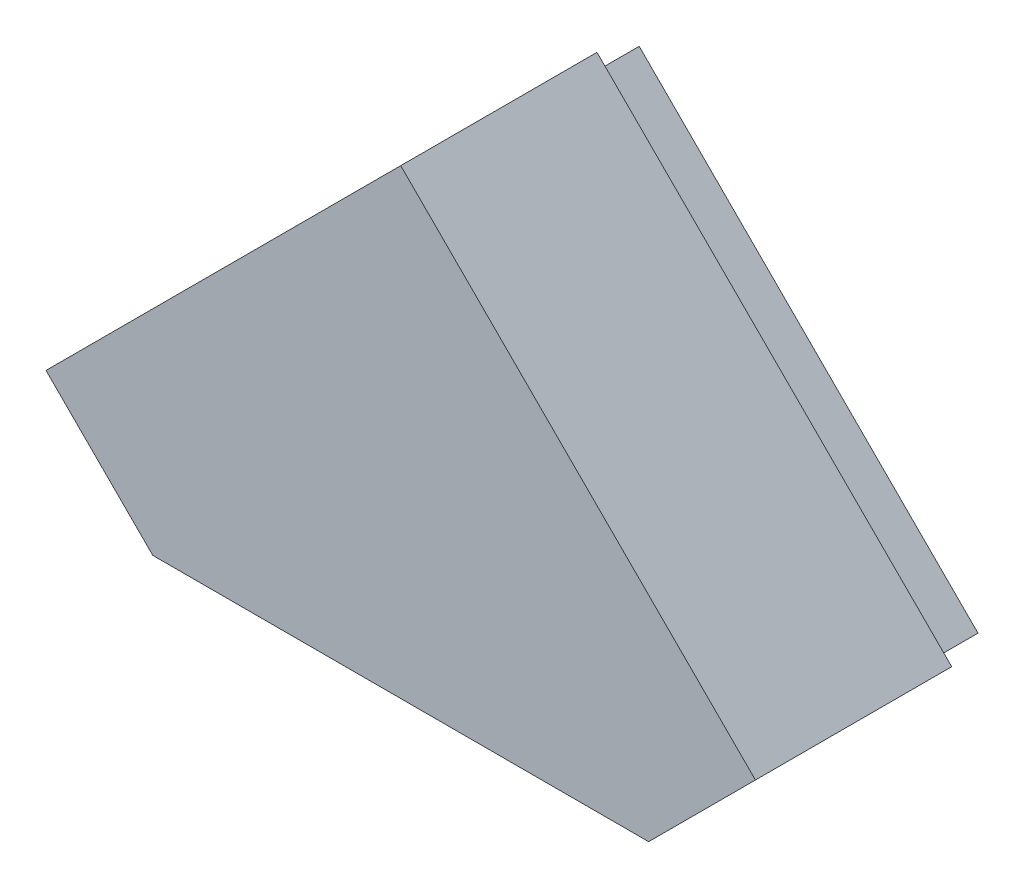
ISO-10303-21;
HEADER;
FILE_DESCRIPTION(('STEP AP214'),'2;1');
FILE_NAME('part.step','',(''),(''),'','','');
FILE_SCHEMA(('AUTOMOTIVE_DESIGN { 1 0 10303 214 1 1 1 1 }'));
ENDSEC;
DATA;
#1=APPLICATION_CONTEXT('core data for automotive mechanical design processes');
#2=APPLICATION_PROTOCOL_DEFINITION('international standard','automotive_design',2000,#1);
#3=PRODUCT_CONTEXT('',#1,'mechanical');
#4=PRODUCT('Part','Part','',(#3));
#5=PRODUCT_RELATED_PRODUCT_CATEGORY('part','',(#4));
#6=PRODUCT_DEFINITION_FORMATION('','',#4);
#7=PRODUCT_DEFINITION_CONTEXT('part definition',#1,'design');
#8=PRODUCT_DEFINITION('design','',#6,#7);
#9=PRODUCT_DEFINITION_SHAPE('','',#8);
#10=(LENGTH_UNIT() NAMED_UNIT(*) SI_UNIT(.MILLI.,.METRE.));
#11=(NAMED_UNIT(*) PLANE_ANGLE_UNIT() SI_UNIT($,.RADIAN.));
#12=(NAMED_UNIT(*) SI_UNIT($,.STERADIAN.) SOLID_ANGLE_UNIT());
#13=UNCERTAINTY_MEASURE_WITH_UNIT(LENGTH_MEASURE(1.E-05),#10,'distance_accuracy_value','');
#14=(GEOMETRIC_REPRESENTATION_CONTEXT(3) GLOBAL_UNCERTAINTY_ASSIGNED_CONTEXT((#13)) GLOBAL_UNIT_ASSIGNED_CONTEXT((#10,
#11,#12)) REPRESENTATION_CONTEXT('',''));
#15=CARTESIAN_POINT('',(0.,0.,0.));
#16=DIRECTION('',(0.,0.,1.));
#17=DIRECTION('',(1.,0.,0.));
#18=AXIS2_PLACEMENT_3D('',#15,#16,#17);
#19=CARTESIAN_POINT('',(-25.2114074291296,19.3014945146996,0.));
#20=DIRECTION('',(0.,0.,1.));
#21=DIRECTION('',(1.,0.,0.));
#22=AXIS2_PLACEMENT_3D('',#19,#20,#21);
#23=PLANE('',#22);
#24=DIRECTION('',(-1.,0.,0.));
#25=VECTOR('',#24,1.);
#26=CARTESIAN_POINT('',(17.2899494936612,-12.7,0.));
#27=LINE('',#26,#25);
#28=CARTESIAN_POINT('',(17.2899494936612,-12.7,0.));
#29=VERTEX_POINT('',#28);
#30=CARTESIAN_POINT('',(11.8,-12.7,0.));
#31=VERTEX_POINT('',#30);
#32=EDGE_CURVE('E112',#29,#31,#27,.T.);
#33=ORIENTED_EDGE('',*,*,#32,.F.);
#34=DIRECTION('',(-0.70710678118655,-0.707106781186545,0.));
#35=VECTOR('',#34,1.);
#36=CARTESIAN_POINT('',(24.0800365792311,-5.90991291443008,0.));
#37=LINE('',#36,#35);
#38=CARTESIAN_POINT('',(24.0800365792311,-5.90991291443008,0.));
#39=VERTEX_POINT('',#38);
#40=EDGE_CURVE('E116',#39,#29,#37,.T.);
#41=ORIENTED_EDGE('',*,*,#40,.F.);
#42=DIRECTION('',(0.707106781186547,-0.707106781186548,0.));
#43=VECTOR('',#42,1.);
#44=CARTESIAN_POINT('',(0.,18.1701236648011,0.));
#45=LINE('',#44,#43);
#46=CARTESIAN_POINT('',(0.,18.1701236648011,0.));
#47=VERTEX_POINT('',#46);
#48=EDGE_CURVE('E304',#47,#39,#45,.T.);
#49=ORIENTED_EDGE('',*,*,#48,.F.);
#50=DIRECTION('',(0.707106781186547,0.707106781186548,0.));
#51=VECTOR('',#50,1.);
#52=CARTESIAN_POINT('',(-24.0800365792311,-5.90991291443006,0.));
#53=LINE('',#52,#51);
#54=CARTESIAN_POINT('',(-24.0800365792311,-5.90991291443006,0.));
#55=VERTEX_POINT('',#54);
#56=EDGE_CURVE('E301',#55,#47,#53,.T.);
#57=ORIENTED_EDGE('',*,*,#56,.F.);
#58=DIRECTION('',(-0.707106781186548,0.707106781186547,0.));
#59=VECTOR('',#58,1.);
#60=CARTESIAN_POINT('',(-17.2899494936612,-12.7,0.));
#61=LINE('',#60,#59);
#62=CARTESIAN_POINT('',(-17.2899494936612,-12.7,0.));
#63=VERTEX_POINT('',#62);
#64=EDGE_CURVE('E298',#63,#55,#61,.T.);
#65=ORIENTED_EDGE('',*,*,#64,.F.);
#66=DIRECTION('',(-1.,0.,0.));
#67=VECTOR('',#66,1.);
#68=CARTESIAN_POINT('',(-11.8,-12.7,0.));
#69=LINE('',#68,#67);
#70=CARTESIAN_POINT('',(-11.8,-12.7,0.));
#71=VERTEX_POINT('',#70);
#72=EDGE_CURVE('E295',#71,#63,#69,.T.);
#73=ORIENTED_EDGE('',*,*,#72,.F.);
#74=DIRECTION('',(0.,1.,0.));
#75=VECTOR('',#74,1.);
#76=CARTESIAN_POINT('',(-11.8,21.375440072005,0.));
#77=LINE('',#76,#75);
#78=CARTESIAN_POINT('',(-11.8,-13.5,0.));
#79=VERTEX_POINT('',#78);
#80=EDGE_CURVE('E329',#79,#71,#77,.T.);
#81=ORIENTED_EDGE('',*,*,#80,.F.);
#82=DIRECTION('',(1.,0.,0.));
#83=VECTOR('',#82,1.);
#84=CARTESIAN_POINT('',(-25.2114074291296,-13.5,0.));
#85=LINE('',#84,#83);
#86=CARTESIAN_POINT('',(-17.6213203435596,-13.5,0.));
#87=VERTEX_POINT('',#86);
#88=EDGE_CURVE('E328',#87,#79,#85,.T.);
#89=ORIENTED_EDGE('',*,*,#88,.F.);
#90=DIRECTION('',(-0.707106781186548,0.707106781186547,0.));
#91=VECTOR('',#90,1.);
#92=CARTESIAN_POINT('',(-24.1507472573498,-6.97057308620988,0.));
#93=LINE('',#92,#91);
#94=CARTESIAN_POINT('',(-25.2114074291296,-5.90991291443006,0.));
#95=VERTEX_POINT('',#94);
#96=EDGE_CURVE('E339',#87,#95,#93,.T.);
#97=ORIENTED_EDGE('',*,*,#96,.T.);
#98=DIRECTION('',(0.707106781186547,0.707106781186548,0.));
#99=VECTOR('',#98,1.);
#100=CARTESIAN_POINT('',(-1.06066017177982,18.2408343429197,0.));
#101=LINE('',#100,#99);
#102=CARTESIAN_POINT('',(0.,19.3014945146996,0.));
#103=VERTEX_POINT('',#102);
#104=EDGE_CURVE('E337',#95,#103,#101,.T.);
#105=ORIENTED_EDGE('',*,*,#104,.T.);
#106=DIRECTION('',(0.707106781186547,-0.707106781186548,0.));
#107=VECTOR('',#106,1.);
#108=CARTESIAN_POINT('',(24.1507472573498,-4.84925274265025,0.));
#109=LINE('',#108,#107);
#110=CARTESIAN_POINT('',(25.2114074291296,-5.90991291443007,0.));
#111=VERTEX_POINT('',#110);
#112=EDGE_CURVE('E335',#103,#111,#109,.T.);
#113=ORIENTED_EDGE('',*,*,#112,.T.);
#114=DIRECTION('',(-0.707106781186549,-0.707106781186546,0.));
#115=VECTOR('',#114,1.);
#116=CARTESIAN_POINT('',(18.0606601717798,-13.0606601717798,0.));
#117=LINE('',#116,#115);
#118=CARTESIAN_POINT('',(17.6213203435596,-13.5,0.));
#119=VERTEX_POINT('',#118);
#120=EDGE_CURVE('E333',#111,#119,#117,.T.);
#121=ORIENTED_EDGE('',*,*,#120,.T.);
#122=CARTESIAN_POINT('',(11.8,-13.5,0.));
#123=VERTEX_POINT('',#122);
#124=EDGE_CURVE('E325',#123,#119,#85,.T.);
#125=ORIENTED_EDGE('',*,*,#124,.F.);
#126=DIRECTION('',(0.,-1.,0.));
#127=VECTOR('',#126,1.);
#128=CARTESIAN_POINT('',(11.8,21.375440072005,0.));
#129=LINE('',#128,#127);
#130=EDGE_CURVE('E331',#31,#123,#129,.T.);
#131=ORIENTED_EDGE('',*,*,#130,.F.);
#132=EDGE_LOOP('',(#33,#41,#49,#57,#65,#73,#81,#89,#97,#105,#113,#121,#125,#131));
#133=FACE_BOUND('',#132,.T.);
#134=ADVANCED_FACE('F95',(#133),#23,.F.);
#135=CARTESIAN_POINT('',(-24.1507472573498,-6.97057308620988,-12.75));
#136=DIRECTION('',(-0.707106781186547,-0.707106781186548,0.));
#137=DIRECTION('',(0.707106781186548,-0.707106781186547,0.));
#138=AXIS2_PLACEMENT_3D('',#135,#136,#137);
#139=PLANE('',#138);
#140=ORIENTED_EDGE('',*,*,#96,.F.);
#141=DIRECTION('',(0.,0.,1.));
#142=VECTOR('',#141,1.);
#143=CARTESIAN_POINT('',(-17.6213203435596,-13.5,-12.75));
#144=LINE('',#143,#142);
#145=CARTESIAN_POINT('',(-17.6213203435596,-13.5,13.95));
#146=VERTEX_POINT('',#145);
#147=EDGE_CURVE('E99',#87,#146,#144,.T.);
#148=ORIENTED_EDGE('',*,*,#147,.T.);
#149=DIRECTION('',(0.707106781186548,-0.707106781186547,0.));
#150=VECTOR('',#149,1.);
#151=CARTESIAN_POINT('',(-25.2114074291296,-5.90991291443006,13.95));
#152=LINE('',#151,#150);
#153=CARTESIAN_POINT('',(-25.2114074291296,-5.90991291443006,13.95));
#154=VERTEX_POINT('',#153);
#155=EDGE_CURVE('E363',#154,#146,#152,.T.);
#156=ORIENTED_EDGE('',*,*,#155,.F.);
#157=DIRECTION('',(0.,0.,1.));
#158=VECTOR('',#157,1.);
#159=CARTESIAN_POINT('',(-25.2114074291296,-5.90991291443006,-12.75));
#160=LINE('',#159,#158);
#161=EDGE_CURVE('E12',#95,#154,#160,.T.);
#162=ORIENTED_EDGE('',*,*,#161,.F.);
#163=EDGE_LOOP('',(#140,#148,#156,#162));
#164=FACE_BOUND('',#163,.T.);
#165=ADVANCED_FACE('F97',(#164),#139,.T.);
#166=CARTESIAN_POINT('',(-1.06066017177982,18.2408343429197,-12.75));
#167=DIRECTION('',(-0.707106781186548,0.707106781186547,0.));
#168=DIRECTION('',(-0.707106781186547,-0.707106781186548,0.));
#169=AXIS2_PLACEMENT_3D('',#166,#167,#168);
#170=PLANE('',#169);
#171=ORIENTED_EDGE('',*,*,#104,.F.);
#172=ORIENTED_EDGE('',*,*,#161,.T.);
#173=DIRECTION('',(-0.707106781186547,-0.707106781186548,0.));
#174=VECTOR('',#173,1.);
#175=CARTESIAN_POINT('',(0.,19.3014945146996,13.95));
#176=LINE('',#175,#174);
#177=CARTESIAN_POINT('',(0.,19.3014945146996,13.95));
#178=VERTEX_POINT('',#177);
#179=EDGE_CURVE('E360',#178,#154,#176,.T.);
#180=ORIENTED_EDGE('',*,*,#179,.F.);
#181=DIRECTION('',(0.,0.,1.));
#182=VECTOR('',#181,1.);
#183=CARTESIAN_POINT('',(0.,19.3014945146996,-12.75));
#184=LINE('',#183,#182);
#185=EDGE_CURVE('E104',#103,#178,#184,.T.);
#186=ORIENTED_EDGE('',*,*,#185,.F.);
#187=EDGE_LOOP('',(#171,#172,#180,#186));
#188=FACE_BOUND('',#187,.T.);
#189=ADVANCED_FACE('F431',(#188),#170,.T.);
#190=CARTESIAN_POINT('',(24.1507472573498,-4.84925274265025,-12.75));
#191=DIRECTION('',(0.707106781186548,0.707106781186547,0.));
#192=DIRECTION('',(-0.707106781186547,0.707106781186548,0.));
#193=AXIS2_PLACEMENT_3D('',#190,#191,#192);
#194=PLANE('',#193);
#195=ORIENTED_EDGE('',*,*,#112,.F.);
#196=ORIENTED_EDGE('',*,*,#185,.T.);
#197=DIRECTION('',(-0.707106781186547,0.707106781186548,0.));
#198=VECTOR('',#197,1.);
#199=CARTESIAN_POINT('',(25.2114074291296,-5.90991291443007,13.95));
#200=LINE('',#199,#198);
#201=CARTESIAN_POINT('',(25.2114074291296,-5.90991291443007,13.95));
#202=VERTEX_POINT('',#201);
#203=EDGE_CURVE('E357',#202,#178,#200,.T.);
#204=ORIENTED_EDGE('',*,*,#203,.F.);
#205=DIRECTION('',(0.,0.,1.));
#206=VECTOR('',#205,1.);
#207=CARTESIAN_POINT('',(25.2114074291296,-5.90991291443007,-12.75));
#208=LINE('',#207,#206);
#209=EDGE_CURVE('E395',#111,#202,#208,.T.);
#210=ORIENTED_EDGE('',*,*,#209,.F.);
#211=EDGE_LOOP('',(#195,#196,#204,#210));
#212=FACE_BOUND('',#211,.T.);
#213=ADVANCED_FACE('F422',(#212),#194,.T.);
#214=CARTESIAN_POINT('',(18.0606601717798,-13.0606601717798,-12.75));
#215=DIRECTION('',(0.707106781186546,-0.707106781186549,0.));
#216=DIRECTION('',(0.707106781186549,0.707106781186546,0.));
#217=AXIS2_PLACEMENT_3D('',#214,#215,#216);
#218=PLANE('',#217);
#219=ORIENTED_EDGE('',*,*,#120,.F.);
#220=ORIENTED_EDGE('',*,*,#209,.T.);
#221=DIRECTION('',(0.707106781186549,0.707106781186546,0.));
#222=VECTOR('',#221,1.);
#223=CARTESIAN_POINT('',(17.6213203435596,-13.5,13.95));
#224=LINE('',#223,#222);
#225=CARTESIAN_POINT('',(17.6213203435596,-13.5,13.95));
#226=VERTEX_POINT('',#225);
#227=EDGE_CURVE('E354',#226,#202,#224,.T.);
#228=ORIENTED_EDGE('',*,*,#227,.F.);
#229=DIRECTION('',(0.,0.,1.));
#230=VECTOR('',#229,1.);
#231=CARTESIAN_POINT('',(17.6213203435596,-13.5,-12.75));
#232=LINE('',#231,#230);
#233=EDGE_CURVE('E396',#119,#226,#232,.T.);
#234=ORIENTED_EDGE('',*,*,#233,.F.);
#235=EDGE_LOOP('',(#219,#220,#228,#234));
#236=FACE_BOUND('',#235,.T.);
#237=ADVANCED_FACE('F414',(#236),#218,.T.);
#238=CARTESIAN_POINT('',(-17.,-13.5,-12.75));
#239=DIRECTION('',(0.,-1.,0.));
#240=DIRECTION('',(0.,0.,-1.));
#241=AXIS2_PLACEMENT_3D('',#238,#239,#240);
#242=PLANE('',#241);
#243=ORIENTED_EDGE('',*,*,#124,.T.);
#244=ORIENTED_EDGE('',*,*,#233,.T.);
#245=DIRECTION('',(1.,0.,0.));
#246=VECTOR('',#245,1.);
#247=CARTESIAN_POINT('',(-17.6213203435596,-13.5,13.95));
#248=LINE('',#247,#246);
#249=EDGE_CURVE('E366',#146,#226,#248,.T.);
#250=ORIENTED_EDGE('',*,*,#249,.F.);
#251=ORIENTED_EDGE('',*,*,#147,.F.);
#252=ORIENTED_EDGE('',*,*,#88,.T.);
#253=DIRECTION('',(0.,0.,-1.));
#254=VECTOR('',#253,1.);
#255=CARTESIAN_POINT('',(-11.8,-13.5,11.8));
#256=LINE('',#255,#254);
#257=CARTESIAN_POINT('',(-11.8,-13.5,11.8));
#258=VERTEX_POINT('',#257);
#259=EDGE_CURVE('E347',#258,#79,#256,.T.);
#260=ORIENTED_EDGE('',*,*,#259,.F.);
#261=DIRECTION('',(-1.,0.,0.));
#262=VECTOR('',#261,1.);
#263=CARTESIAN_POINT('',(-11.8,-13.5,11.8));
#264=LINE('',#263,#262);
#265=CARTESIAN_POINT('',(11.8,-13.5,11.8));
#266=VERTEX_POINT('',#265);
#267=EDGE_CURVE('E344',#266,#258,#264,.T.);
#268=ORIENTED_EDGE('',*,*,#267,.F.);
#269=DIRECTION('',(0.,0.,1.));
#270=VECTOR('',#269,1.);
#271=CARTESIAN_POINT('',(11.8,-13.5,11.8));
#272=LINE('',#271,#270);
#273=EDGE_CURVE('E340',#123,#266,#272,.T.);
#274=ORIENTED_EDGE('',*,*,#273,.F.);
#275=EDGE_LOOP('',(#243,#244,#250,#251,#252,#260,#268,#274));
#276=FACE_BOUND('',#275,.T.);
#277=ADVANCED_FACE('F410',(#276),#242,.T.);
#278=CARTESIAN_POINT('',(0.,0.,13.95));
#279=DIRECTION('',(0.,0.,1.));
#280=DIRECTION('',(1.,0.,0.));
#281=AXIS2_PLACEMENT_3D('',#278,#279,#280);
#282=PLANE('',#281);
#283=ORIENTED_EDGE('',*,*,#227,.T.);
#284=ORIENTED_EDGE('',*,*,#203,.T.);
#285=ORIENTED_EDGE('',*,*,#179,.T.);
#286=ORIENTED_EDGE('',*,*,#155,.T.);
#287=ORIENTED_EDGE('',*,*,#249,.T.);
#288=EDGE_LOOP('',(#283,#284,#285,#286,#287));
#289=FACE_BOUND('',#288,.T.);
#290=ADVANCED_FACE('F407',(#289),#282,.T.);
#291=CARTESIAN_POINT('',(11.8,21.375440072005,11.8));
#292=DIRECTION('',(1.,0.,0.));
#293=DIRECTION('',(0.,0.,-1.));
#294=AXIS2_PLACEMENT_3D('',#291,#292,#293);
#295=PLANE('',#294);
#296=DIRECTION('',(0.,0.,-1.));
#297=VECTOR('',#296,1.);
#298=CARTESIAN_POINT('',(11.8,-12.,11.8));
#299=LINE('',#298,#297);
#300=CARTESIAN_POINT('',(11.8,-12.,11.8));
#301=VERTEX_POINT('',#300);
#302=CARTESIAN_POINT('',(11.8,-12.,-3.));
#303=VERTEX_POINT('',#302);
#304=EDGE_CURVE('E246',#301,#303,#299,.T.);
#305=ORIENTED_EDGE('',*,*,#304,.T.);
#306=DIRECTION('',(0.,1.,0.));
#307=VECTOR('',#306,1.);
#308=CARTESIAN_POINT('',(11.8,-12.7,-3.));
#309=LINE('',#308,#307);
#310=CARTESIAN_POINT('',(11.8,-12.7,-3.));
#311=VERTEX_POINT('',#310);
#312=EDGE_CURVE('E279',#311,#303,#309,.T.);
#313=ORIENTED_EDGE('',*,*,#312,.F.);
#314=DIRECTION('',(0.,0.,1.));
#315=VECTOR('',#314,1.);
#316=CARTESIAN_POINT('',(11.8,-12.7,-3.));
#317=LINE('',#316,#315);
#318=EDGE_CURVE('E294',#311,#31,#317,.T.);
#319=ORIENTED_EDGE('',*,*,#318,.T.);
#320=ORIENTED_EDGE('',*,*,#130,.T.);
#321=ORIENTED_EDGE('',*,*,#273,.T.);
#322=DIRECTION('',(0.,-1.,0.));
#323=VECTOR('',#322,1.);
#324=CARTESIAN_POINT('',(11.8,21.375440072005,11.8));
#325=LINE('',#324,#323);
#326=EDGE_CURVE('E349',#301,#266,#325,.T.);
#327=ORIENTED_EDGE('',*,*,#326,.F.);
#328=EDGE_LOOP('',(#305,#313,#319,#320,#321,#327));
#329=FACE_BOUND('',#328,.T.);
#330=ADVANCED_FACE('F420',(#329),#295,.F.);
#331=CARTESIAN_POINT('',(-11.8,21.375440072005,11.8));
#332=DIRECTION('',(-1.,0.,0.));
#333=DIRECTION('',(0.,0.,1.));
#334=AXIS2_PLACEMENT_3D('',#331,#332,#333);
#335=PLANE('',#334);
#336=ORIENTED_EDGE('',*,*,#259,.T.);
#337=ORIENTED_EDGE('',*,*,#80,.T.);
#338=DIRECTION('',(0.,0.,1.));
#339=VECTOR('',#338,1.);
#340=CARTESIAN_POINT('',(-11.8,-12.7,-3.));
#341=LINE('',#340,#339);
#342=CARTESIAN_POINT('',(-11.8,-12.7,-3.));
#343=VERTEX_POINT('',#342);
#344=EDGE_CURVE('E255',#343,#71,#341,.T.);
#345=ORIENTED_EDGE('',*,*,#344,.F.);
#346=DIRECTION('',(0.,-1.,0.));
#347=VECTOR('',#346,1.);
#348=CARTESIAN_POINT('',(-11.8,-12.,-3.));
#349=LINE('',#348,#347);
#350=CARTESIAN_POINT('',(-11.8,-12.,-3.));
#351=VERTEX_POINT('',#350);
#352=EDGE_CURVE('E250',#351,#343,#349,.T.);
#353=ORIENTED_EDGE('',*,*,#352,.F.);
#354=DIRECTION('',(0.,0.,1.));
#355=VECTOR('',#354,1.);
#356=CARTESIAN_POINT('',(-11.8,-12.,11.8));
#357=LINE('',#356,#355);
#358=CARTESIAN_POINT('',(-11.8,-12.,11.8));
#359=VERTEX_POINT('',#358);
#360=EDGE_CURVE('E237',#351,#359,#357,.T.);
#361=ORIENTED_EDGE('',*,*,#360,.T.);
#362=DIRECTION('',(0.,-1.,0.));
#363=VECTOR('',#362,1.);
#364=CARTESIAN_POINT('',(-11.8,21.375440072005,11.8));
#365=LINE('',#364,#363);
#366=EDGE_CURVE('E247',#359,#258,#365,.T.);
#367=ORIENTED_EDGE('',*,*,#366,.T.);
#368=EDGE_LOOP('',(#336,#337,#345,#353,#361,#367));
#369=FACE_BOUND('',#368,.T.);
#370=ADVANCED_FACE('F252',(#369),#335,.F.);
#371=CARTESIAN_POINT('',(-11.8,21.375440072005,11.8));
#372=DIRECTION('',(0.,0.,1.));
#373=DIRECTION('',(1.,0.,0.));
#374=AXIS2_PLACEMENT_3D('',#371,#372,#373);
#375=PLANE('',#374);
#376=DIRECTION('',(1.,0.,0.));
#377=VECTOR('',#376,1.);
#378=CARTESIAN_POINT('',(-11.8,-12.,11.8));
#379=LINE('',#378,#377);
#380=EDGE_CURVE('E243',#359,#301,#379,.T.);
#381=ORIENTED_EDGE('',*,*,#380,.T.);
#382=ORIENTED_EDGE('',*,*,#326,.T.);
#383=ORIENTED_EDGE('',*,*,#267,.T.);
#384=ORIENTED_EDGE('',*,*,#366,.F.);
#385=EDGE_LOOP('',(#381,#382,#383,#384));
#386=FACE_BOUND('',#385,.T.);
#387=ADVANCED_FACE('F438',(#386),#375,.F.);
#388=CARTESIAN_POINT('',(-17.,-12.,-12.75));
#389=DIRECTION('',(0.,-1.,0.));
#390=DIRECTION('',(0.,0.,-1.));
#391=AXIS2_PLACEMENT_3D('',#388,#389,#390);
#392=PLANE('',#391);
#393=DIRECTION('',(0.,0.,1.));
#394=VECTOR('',#393,1.);
#395=CARTESIAN_POINT('',(17.,-12.,-12.75));
#396=LINE('',#395,#394);
#397=CARTESIAN_POINT('',(17.,-12.,-3.));
#398=VERTEX_POINT('',#397);
#399=CARTESIAN_POINT('',(17.,-12.,12.75));
#400=VERTEX_POINT('',#399);
#401=EDGE_CURVE('E391',#398,#400,#396,.T.);
#402=ORIENTED_EDGE('',*,*,#401,.F.);
#403=DIRECTION('',(1.,0.,0.));
#404=VECTOR('',#403,1.);
#405=CARTESIAN_POINT('',(11.8,-12.,-3.));
#406=LINE('',#405,#404);
#407=EDGE_CURVE('E282',#303,#398,#406,.T.);
#408=ORIENTED_EDGE('',*,*,#407,.F.);
#409=ORIENTED_EDGE('',*,*,#304,.F.);
#410=ORIENTED_EDGE('',*,*,#380,.F.);
#411=ORIENTED_EDGE('',*,*,#360,.F.);
#412=DIRECTION('',(1.,0.,0.));
#413=VECTOR('',#412,1.);
#414=CARTESIAN_POINT('',(-17.,-12.,-3.));
#415=LINE('',#414,#413);
#416=CARTESIAN_POINT('',(-17.,-12.,-3.));
#417=VERTEX_POINT('',#416);
#418=EDGE_CURVE('E241',#417,#351,#415,.T.);
#419=ORIENTED_EDGE('',*,*,#418,.F.);
#420=DIRECTION('',(0.,0.,1.));
#421=VECTOR('',#420,1.);
#422=CARTESIAN_POINT('',(-17.,-12.,-12.75));
#423=LINE('',#422,#421);
#424=CARTESIAN_POINT('',(-17.,-12.,12.75));
#425=VERTEX_POINT('',#424);
#426=EDGE_CURVE('E384',#417,#425,#423,.T.);
#427=ORIENTED_EDGE('',*,*,#426,.T.);
#428=DIRECTION('',(1.,0.,0.));
#429=VECTOR('',#428,1.);
#430=CARTESIAN_POINT('',(-17.,-12.,12.75));
#431=LINE('',#430,#429);
#432=EDGE_CURVE('E372',#425,#400,#431,.T.);
#433=ORIENTED_EDGE('',*,*,#432,.T.);
#434=EDGE_LOOP('',(#402,#408,#409,#410,#411,#419,#427,#433));
#435=FACE_BOUND('',#434,.T.);
#436=ADVANCED_FACE('F239',(#435),#392,.F.);
#437=CARTESIAN_POINT('',(0.,0.,12.75));
#438=DIRECTION('',(0.,0.,1.));
#439=DIRECTION('',(1.,0.,0.));
#440=AXIS2_PLACEMENT_3D('',#437,#438,#439);
#441=PLANE('',#440);
#442=ORIENTED_EDGE('',*,*,#432,.F.);
#443=DIRECTION('',(0.707106781186548,-0.707106781186547,0.));
#444=VECTOR('',#443,1.);
#445=CARTESIAN_POINT('',(-23.09008708557,-5.90991291443006,12.75));
#446=LINE('',#445,#444);
#447=CARTESIAN_POINT('',(-23.09008708557,-5.90991291443006,12.75));
#448=VERTEX_POINT('',#447);
#449=EDGE_CURVE('E369',#448,#425,#446,.T.);
#450=ORIENTED_EDGE('',*,*,#449,.F.);
#451=DIRECTION('',(-0.707106781186547,-0.707106781186548,0.));
#452=VECTOR('',#451,1.);
#453=CARTESIAN_POINT('',(0.,17.1801741711399,12.75));
#454=LINE('',#453,#452);
#455=CARTESIAN_POINT('',(0.,17.1801741711399,12.75));
#456=VERTEX_POINT('',#455);
#457=EDGE_CURVE('E381',#456,#448,#454,.T.);
#458=ORIENTED_EDGE('',*,*,#457,.F.);
#459=DIRECTION('',(-0.707106781186547,0.707106781186548,0.));
#460=VECTOR('',#459,1.);
#461=CARTESIAN_POINT('',(23.09008708557,-5.90991291443007,12.75));
#462=LINE('',#461,#460);
#463=CARTESIAN_POINT('',(23.09008708557,-5.90991291443007,12.75));
#464=VERTEX_POINT('',#463);
#465=EDGE_CURVE('E378',#464,#456,#462,.T.);
#466=ORIENTED_EDGE('',*,*,#465,.F.);
#467=DIRECTION('',(0.707106781186549,0.707106781186546,0.));
#468=VECTOR('',#467,1.);
#469=CARTESIAN_POINT('',(17.,-12.,12.75));
#470=LINE('',#469,#468);
#471=EDGE_CURVE('E375',#400,#464,#470,.T.);
#472=ORIENTED_EDGE('',*,*,#471,.F.);
#473=EDGE_LOOP('',(#442,#450,#458,#466,#472));
#474=FACE_BOUND('',#473,.T.);
#475=ADVANCED_FACE('F444',(#474),#441,.F.);
#476=CARTESIAN_POINT('',(23.09008708557,-5.90991291443007,-12.75));
#477=DIRECTION('',(0.707106781186548,0.707106781186547,0.));
#478=DIRECTION('',(-0.707106781186547,0.707106781186548,0.));
#479=AXIS2_PLACEMENT_3D('',#476,#477,#478);
#480=PLANE('',#479);
#481=DIRECTION('',(0.,0.,1.));
#482=VECTOR('',#481,1.);
#483=CARTESIAN_POINT('',(0.,17.1801741711399,-12.75));
#484=LINE('',#483,#482);
#485=CARTESIAN_POINT('',(0.,17.1801741711399,-3.));
#486=VERTEX_POINT('',#485);
#487=EDGE_CURVE('E387',#486,#456,#484,.T.);
#488=ORIENTED_EDGE('',*,*,#487,.F.);
#489=DIRECTION('',(-0.707106781186547,0.707106781186548,0.));
#490=VECTOR('',#489,1.);
#491=CARTESIAN_POINT('',(23.09008708557,-5.90991291443007,-3.));
#492=LINE('',#491,#490);
#493=CARTESIAN_POINT('',(23.09008708557,-5.90991291443007,-3.));
#494=VERTEX_POINT('',#493);
#495=EDGE_CURVE('E288',#494,#486,#492,.T.);
#496=ORIENTED_EDGE('',*,*,#495,.F.);
#497=DIRECTION('',(0.,0.,1.));
#498=VECTOR('',#497,1.);
#499=CARTESIAN_POINT('',(23.09008708557,-5.90991291443007,-12.75));
#500=LINE('',#499,#498);
#501=EDGE_CURVE('E389',#494,#464,#500,.T.);
#502=ORIENTED_EDGE('',*,*,#501,.T.);
#503=ORIENTED_EDGE('',*,*,#465,.T.);
#504=EDGE_LOOP('',(#488,#496,#502,#503));
#505=FACE_BOUND('',#504,.T.);
#506=ADVANCED_FACE('F446',(#505),#480,.F.);
#507=CARTESIAN_POINT('',(17.,-12.,-12.75));
#508=DIRECTION('',(0.707106781186546,-0.707106781186549,0.));
#509=DIRECTION('',(0.707106781186549,0.707106781186546,0.));
#510=AXIS2_PLACEMENT_3D('',#507,#508,#509);
#511=PLANE('',#510);
#512=ORIENTED_EDGE('',*,*,#501,.F.);
#513=DIRECTION('',(0.707106781186549,0.707106781186546,0.));
#514=VECTOR('',#513,1.);
#515=CARTESIAN_POINT('',(17.,-12.,-3.));
#516=LINE('',#515,#514);
#517=EDGE_CURVE('E285',#398,#494,#516,.T.);
#518=ORIENTED_EDGE('',*,*,#517,.F.);
#519=ORIENTED_EDGE('',*,*,#401,.T.);
#520=ORIENTED_EDGE('',*,*,#471,.T.);
#521=EDGE_LOOP('',(#512,#518,#519,#520));
#522=FACE_BOUND('',#521,.T.);
#523=ADVANCED_FACE('F455',(#522),#511,.F.);
#524=CARTESIAN_POINT('',(-23.09008708557,-5.90991291443006,-12.75));
#525=DIRECTION('',(-0.707106781186547,-0.707106781186548,0.));
#526=DIRECTION('',(0.707106781186548,-0.707106781186547,0.));
#527=AXIS2_PLACEMENT_3D('',#524,#525,#526);
#528=PLANE('',#527);
#529=ORIENTED_EDGE('',*,*,#426,.F.);
#530=DIRECTION('',(0.707106781186548,-0.707106781186547,0.));
#531=VECTOR('',#530,1.);
#532=CARTESIAN_POINT('',(-23.09008708557,-5.90991291443006,-3.));
#533=LINE('',#532,#531);
#534=CARTESIAN_POINT('',(-23.09008708557,-5.90991291443006,-3.));
#535=VERTEX_POINT('',#534);
#536=EDGE_CURVE('E264',#535,#417,#533,.T.);
#537=ORIENTED_EDGE('',*,*,#536,.F.);
#538=DIRECTION('',(0.,0.,1.));
#539=VECTOR('',#538,1.);
#540=CARTESIAN_POINT('',(-23.09008708557,-5.90991291443006,-12.75));
#541=LINE('',#540,#539);
#542=EDGE_CURVE('E385',#535,#448,#541,.T.);
#543=ORIENTED_EDGE('',*,*,#542,.T.);
#544=ORIENTED_EDGE('',*,*,#449,.T.);
#545=EDGE_LOOP('',(#529,#537,#543,#544));
#546=FACE_BOUND('',#545,.T.);
#547=ADVANCED_FACE('F451',(#546),#528,.F.);
#548=CARTESIAN_POINT('',(0.,17.1801741711399,-12.75));
#549=DIRECTION('',(-0.707106781186548,0.707106781186547,0.));
#550=DIRECTION('',(-0.707106781186547,-0.707106781186548,0.));
#551=AXIS2_PLACEMENT_3D('',#548,#549,#550);
#552=PLANE('',#551);
#553=ORIENTED_EDGE('',*,*,#542,.F.);
#554=DIRECTION('',(-0.707106781186547,-0.707106781186548,0.));
#555=VECTOR('',#554,1.);
#556=CARTESIAN_POINT('',(0.,17.1801741711399,-3.));
#557=LINE('',#556,#555);
#558=EDGE_CURVE('E291',#486,#535,#557,.T.);
#559=ORIENTED_EDGE('',*,*,#558,.F.);
#560=ORIENTED_EDGE('',*,*,#487,.T.);
#561=ORIENTED_EDGE('',*,*,#457,.T.);
#562=EDGE_LOOP('',(#553,#559,#560,#561));
#563=FACE_BOUND('',#562,.T.);
#564=ADVANCED_FACE('F448',(#563),#552,.F.);
#565=CARTESIAN_POINT('',(-11.8,-12.7,-3.));
#566=DIRECTION('',(0.,1.,0.));
#567=DIRECTION('',(0.,0.,1.));
#568=AXIS2_PLACEMENT_3D('',#565,#566,#567);
#569=PLANE('',#568);
#570=ORIENTED_EDGE('',*,*,#72,.T.);
#571=DIRECTION('',(0.,0.,1.));
#572=VECTOR('',#571,1.);
#573=CARTESIAN_POINT('',(-17.2899494936612,-12.7,-3.));
#574=LINE('',#573,#572);
#575=CARTESIAN_POINT('',(-17.2899494936612,-12.7,-3.));
#576=VERTEX_POINT('',#575);
#577=EDGE_CURVE('E321',#576,#63,#574,.T.);
#578=ORIENTED_EDGE('',*,*,#577,.F.);
#579=DIRECTION('',(-1.,0.,0.));
#580=VECTOR('',#579,1.);
#581=CARTESIAN_POINT('',(-11.8,-12.7,-3.));
#582=LINE('',#581,#580);
#583=EDGE_CURVE('E258',#343,#576,#582,.T.);
#584=ORIENTED_EDGE('',*,*,#583,.F.);
#585=ORIENTED_EDGE('',*,*,#344,.T.);
#586=EDGE_LOOP('',(#570,#578,#584,#585));
#587=FACE_BOUND('',#586,.T.);
#588=ADVANCED_FACE('F434',(#587),#569,.F.);
#589=CARTESIAN_POINT('',(-17.2899494936612,-12.7,-3.));
#590=DIRECTION('',(0.707106781186547,0.707106781186548,0.));
#591=DIRECTION('',(-0.707106781186548,0.707106781186547,0.));
#592=AXIS2_PLACEMENT_3D('',#589,#590,#591);
#593=PLANE('',#592);
#594=ORIENTED_EDGE('',*,*,#64,.T.);
#595=DIRECTION('',(0.,0.,1.));
#596=VECTOR('',#595,1.);
#597=CARTESIAN_POINT('',(-24.0800365792311,-5.90991291443006,-3.));
#598=LINE('',#597,#596);
#599=CARTESIAN_POINT('',(-24.0800365792311,-5.90991291443006,-3.));
#600=VERTEX_POINT('',#599);
#601=EDGE_CURVE('E318',#600,#55,#598,.T.);
#602=ORIENTED_EDGE('',*,*,#601,.F.);
#603=DIRECTION('',(-0.707106781186548,0.707106781186547,0.));
#604=VECTOR('',#603,1.);
#605=CARTESIAN_POINT('',(-17.2899494936612,-12.7,-3.));
#606=LINE('',#605,#604);
#607=EDGE_CURVE('E269',#576,#600,#606,.T.);
#608=ORIENTED_EDGE('',*,*,#607,.F.);
#609=ORIENTED_EDGE('',*,*,#577,.T.);
#610=EDGE_LOOP('',(#594,#602,#608,#609));
#611=FACE_BOUND('',#610,.T.);
#612=ADVANCED_FACE('F501',(#611),#593,.F.);
#613=CARTESIAN_POINT('',(-24.0800365792311,-5.90991291443006,-3.));
#614=DIRECTION('',(0.707106781186548,-0.707106781186547,0.));
#615=DIRECTION('',(0.707106781186547,0.707106781186548,0.));
#616=AXIS2_PLACEMENT_3D('',#613,#614,#615);
#617=PLANE('',#616);
#618=ORIENTED_EDGE('',*,*,#56,.T.);
#619=DIRECTION('',(0.,0.,1.));
#620=VECTOR('',#619,1.);
#621=CARTESIAN_POINT('',(0.,18.1701236648011,-3.));
#622=LINE('',#621,#620);
#623=CARTESIAN_POINT('',(0.,18.1701236648011,-3.));
#624=VERTEX_POINT('',#623);
#625=EDGE_CURVE('E315',#624,#47,#622,.T.);
#626=ORIENTED_EDGE('',*,*,#625,.F.);
#627=DIRECTION('',(0.707106781186547,0.707106781186548,0.));
#628=VECTOR('',#627,1.);
#629=CARTESIAN_POINT('',(-24.0800365792311,-5.90991291443006,-3.));
#630=LINE('',#629,#628);
#631=EDGE_CURVE('E271',#600,#624,#630,.T.);
#632=ORIENTED_EDGE('',*,*,#631,.F.);
#633=ORIENTED_EDGE('',*,*,#601,.T.);
#634=EDGE_LOOP('',(#618,#626,#632,#633));
#635=FACE_BOUND('',#634,.T.);
#636=ADVANCED_FACE('F496',(#635),#617,.F.);
#637=CARTESIAN_POINT('',(0.,18.1701236648011,-3.));
#638=DIRECTION('',(-0.707106781186548,-0.707106781186547,0.));
#639=DIRECTION('',(0.707106781186547,-0.707106781186548,0.));
#640=AXIS2_PLACEMENT_3D('',#637,#638,#639);
#641=PLANE('',#640);
#642=ORIENTED_EDGE('',*,*,#48,.T.);
#643=DIRECTION('',(0.,0.,1.));
#644=VECTOR('',#643,1.);
#645=CARTESIAN_POINT('',(24.0800365792311,-5.90991291443008,-3.));
#646=LINE('',#645,#644);
#647=CARTESIAN_POINT('',(24.0800365792311,-5.90991291443008,-3.));
#648=VERTEX_POINT('',#647);
#649=EDGE_CURVE('E312',#648,#39,#646,.T.);
#650=ORIENTED_EDGE('',*,*,#649,.F.);
#651=DIRECTION('',(0.707106781186547,-0.707106781186548,0.));
#652=VECTOR('',#651,1.);
#653=CARTESIAN_POINT('',(0.,18.1701236648011,-3.));
#654=LINE('',#653,#652);
#655=EDGE_CURVE('E273',#624,#648,#654,.T.);
#656=ORIENTED_EDGE('',*,*,#655,.F.);
#657=ORIENTED_EDGE('',*,*,#625,.T.);
#658=EDGE_LOOP('',(#642,#650,#656,#657));
#659=FACE_BOUND('',#658,.T.);
#660=ADVANCED_FACE('F493',(#659),#641,.F.);
#661=CARTESIAN_POINT('',(24.0800365792311,-5.90991291443008,-3.));
#662=DIRECTION('',(-0.707106781186545,0.70710678118655,0.));
#663=DIRECTION('',(-0.70710678118655,-0.707106781186545,0.));
#664=AXIS2_PLACEMENT_3D('',#661,#662,#663);
#665=PLANE('',#664);
#666=ORIENTED_EDGE('',*,*,#40,.T.);
#667=DIRECTION('',(0.,0.,1.));
#668=VECTOR('',#667,1.);
#669=CARTESIAN_POINT('',(17.2899494936612,-12.7,-3.));
#670=LINE('',#669,#668);
#671=CARTESIAN_POINT('',(17.2899494936612,-12.7,-3.));
#672=VERTEX_POINT('',#671);
#673=EDGE_CURVE('E309',#672,#29,#670,.T.);
#674=ORIENTED_EDGE('',*,*,#673,.F.);
#675=DIRECTION('',(-0.70710678118655,-0.707106781186545,0.));
#676=VECTOR('',#675,1.);
#677=CARTESIAN_POINT('',(24.0800365792311,-5.90991291443008,-3.));
#678=LINE('',#677,#676);
#679=EDGE_CURVE('E275',#648,#672,#678,.T.);
#680=ORIENTED_EDGE('',*,*,#679,.F.);
#681=ORIENTED_EDGE('',*,*,#649,.T.);
#682=EDGE_LOOP('',(#666,#674,#680,#681));
#683=FACE_BOUND('',#682,.T.);
#684=ADVANCED_FACE('F489',(#683),#665,.F.);
#685=CARTESIAN_POINT('',(17.2899494936612,-12.7,-3.));
#686=DIRECTION('',(0.,1.,0.));
#687=DIRECTION('',(0.,0.,1.));
#688=AXIS2_PLACEMENT_3D('',#685,#686,#687);
#689=PLANE('',#688);
#690=ORIENTED_EDGE('',*,*,#32,.T.);
#691=ORIENTED_EDGE('',*,*,#318,.F.);
#692=DIRECTION('',(-1.,0.,0.));
#693=VECTOR('',#692,1.);
#694=CARTESIAN_POINT('',(17.2899494936612,-12.7,-3.));
#695=LINE('',#694,#693);
#696=EDGE_CURVE('E277',#672,#311,#695,.T.);
#697=ORIENTED_EDGE('',*,*,#696,.F.);
#698=ORIENTED_EDGE('',*,*,#673,.T.);
#699=EDGE_LOOP('',(#690,#691,#697,#698));
#700=FACE_BOUND('',#699,.T.);
#701=ADVANCED_FACE('F484',(#700),#689,.F.);
#702=CARTESIAN_POINT('',(0.,0.,-3.));
#703=DIRECTION('',(0.,0.,-1.));
#704=DIRECTION('',(-1.,0.,0.));
#705=AXIS2_PLACEMENT_3D('',#702,#703,#704);
#706=PLANE('',#705);
#707=ORIENTED_EDGE('',*,*,#418,.T.);
#708=ORIENTED_EDGE('',*,*,#352,.T.);
#709=ORIENTED_EDGE('',*,*,#583,.T.);
#710=ORIENTED_EDGE('',*,*,#607,.T.);
#711=ORIENTED_EDGE('',*,*,#631,.T.);
#712=ORIENTED_EDGE('',*,*,#655,.T.);
#713=ORIENTED_EDGE('',*,*,#679,.T.);
#714=ORIENTED_EDGE('',*,*,#696,.T.);
#715=ORIENTED_EDGE('',*,*,#312,.T.);
#716=ORIENTED_EDGE('',*,*,#407,.T.);
#717=ORIENTED_EDGE('',*,*,#517,.T.);
#718=ORIENTED_EDGE('',*,*,#495,.T.);
#719=ORIENTED_EDGE('',*,*,#558,.T.);
#720=ORIENTED_EDGE('',*,*,#536,.T.);
#721=EDGE_LOOP('',(#707,#708,#709,#710,#711,#712,#713,#714,#715,#716,#717,#718,#719,#720));
#722=FACE_BOUND('',#721,.T.);
#723=ADVANCED_FACE('F261',(#722),#706,.T.);
#724=CLOSED_SHELL('',(#134,#165,#189,#213,#237,#277,#290,#330,#370,#387,#436,#475,#506,#523,
#547,#564,#588,#612,#636,#660,#684,#701,#723));
#725=MANIFOLD_SOLID_BREP('B2',#724);
#726=ADVANCED_BREP_SHAPE_REPRESENTATION('',(#18,#725),#14);
#727=SHAPE_DEFINITION_REPRESENTATION(#9,#726);
ENDSEC;
END-ISO-10303-21;
